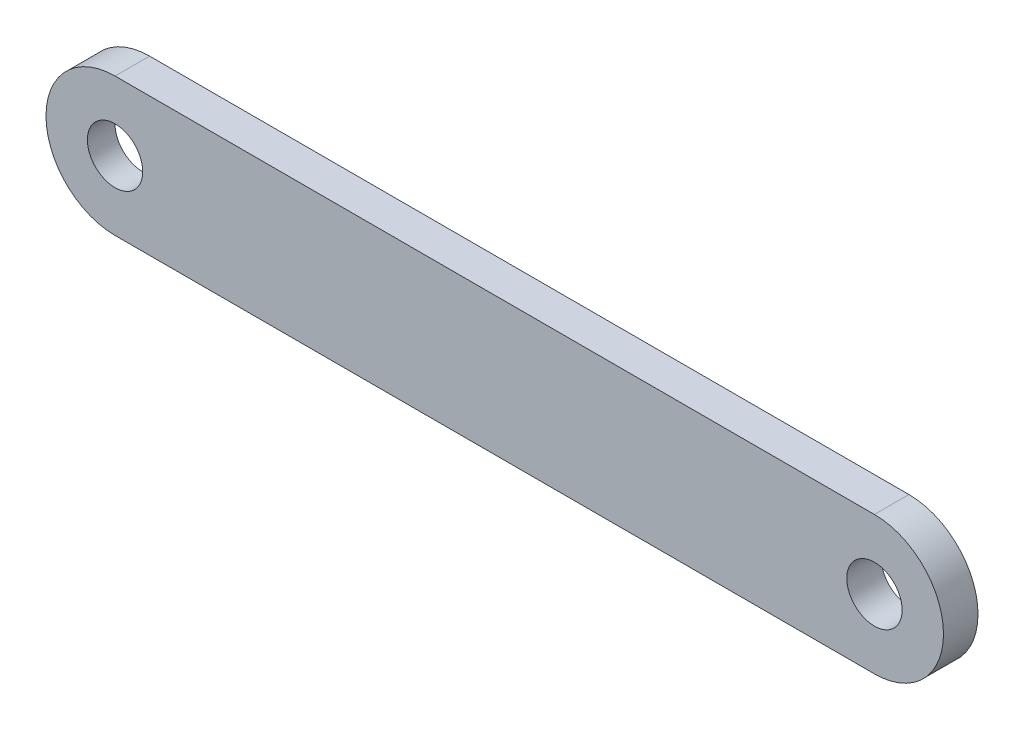
ISO-10303-21;
HEADER;
FILE_DESCRIPTION(('STEP AP214'),'2;1');
FILE_NAME('part.step','',(''),(''),'','','');
FILE_SCHEMA(('AUTOMOTIVE_DESIGN { 1 0 10303 214 1 1 1 1 }'));
ENDSEC;
DATA;
#1=APPLICATION_CONTEXT('core data for automotive mechanical design processes');
#2=APPLICATION_PROTOCOL_DEFINITION('international standard','automotive_design',2000,#1);
#3=PRODUCT_CONTEXT('',#1,'mechanical');
#4=PRODUCT('Part','Part','',(#3));
#5=PRODUCT_RELATED_PRODUCT_CATEGORY('part','',(#4));
#6=PRODUCT_DEFINITION_FORMATION('','',#4);
#7=PRODUCT_DEFINITION_CONTEXT('part definition',#1,'design');
#8=PRODUCT_DEFINITION('design','',#6,#7);
#9=PRODUCT_DEFINITION_SHAPE('','',#8);
#10=(LENGTH_UNIT() NAMED_UNIT(*) SI_UNIT(.MILLI.,.METRE.));
#11=(NAMED_UNIT(*) PLANE_ANGLE_UNIT() SI_UNIT($,.RADIAN.));
#12=(NAMED_UNIT(*) SI_UNIT($,.STERADIAN.) SOLID_ANGLE_UNIT());
#13=UNCERTAINTY_MEASURE_WITH_UNIT(LENGTH_MEASURE(1.E-05),#10,'distance_accuracy_value','');
#14=(GEOMETRIC_REPRESENTATION_CONTEXT(3) GLOBAL_UNCERTAINTY_ASSIGNED_CONTEXT((#13)) GLOBAL_UNIT_ASSIGNED_CONTEXT((#10,
#11,#12)) REPRESENTATION_CONTEXT('',''));
#15=CARTESIAN_POINT('',(0.,0.,0.));
#16=DIRECTION('',(0.,0.,1.));
#17=DIRECTION('',(1.,0.,0.));
#18=AXIS2_PLACEMENT_3D('',#15,#16,#17);
#19=CARTESIAN_POINT('',(0.,0.,5.));
#20=DIRECTION('',(0.,0.,-1.));
#21=DIRECTION('',(-1.,0.,0.));
#22=AXIS2_PLACEMENT_3D('',#19,#20,#21);
#23=CYLINDRICAL_SURFACE('',#22,10.);
#24=CARTESIAN_POINT('',(0.,0.,0.));
#25=DIRECTION('',(0.,0.,1.));
#26=DIRECTION('',(1.,0.,0.));
#27=AXIS2_PLACEMENT_3D('',#24,#25,#26);
#28=CIRCLE('',#27,10.);
#29=CARTESIAN_POINT('',(0.,10.,0.));
#30=VERTEX_POINT('',#29);
#31=CARTESIAN_POINT('',(0.,-10.,0.));
#32=VERTEX_POINT('',#31);
#33=EDGE_CURVE('E151',#30,#32,#28,.T.);
#34=ORIENTED_EDGE('',*,*,#33,.T.);
#35=DIRECTION('',(0.,0.,-1.));
#36=VECTOR('',#35,1.);
#37=CARTESIAN_POINT('',(0.,-10.,5.));
#38=LINE('',#37,#36);
#39=CARTESIAN_POINT('',(0.,-10.,5.));
#40=VERTEX_POINT('',#39);
#41=EDGE_CURVE('E44',#40,#32,#38,.T.);
#42=ORIENTED_EDGE('',*,*,#41,.F.);
#43=CARTESIAN_POINT('',(0.,0.,5.));
#44=DIRECTION('',(0.,0.,1.));
#45=DIRECTION('',(1.,0.,0.));
#46=AXIS2_PLACEMENT_3D('',#43,#44,#45);
#47=CIRCLE('',#46,10.);
#48=CARTESIAN_POINT('',(0.,10.,5.));
#49=VERTEX_POINT('',#48);
#50=EDGE_CURVE('E155',#49,#40,#47,.T.);
#51=ORIENTED_EDGE('',*,*,#50,.F.);
#52=DIRECTION('',(0.,0.,-1.));
#53=VECTOR('',#52,1.);
#54=CARTESIAN_POINT('',(0.,10.,5.));
#55=LINE('',#54,#53);
#56=EDGE_CURVE('E60',#49,#30,#55,.T.);
#57=ORIENTED_EDGE('',*,*,#56,.T.);
#58=EDGE_LOOP('',(#34,#42,#51,#57));
#59=FACE_BOUND('',#58,.T.);
#60=ADVANCED_FACE('F35',(#59),#23,.T.);
#61=CARTESIAN_POINT('',(0.,-10.,5.));
#62=DIRECTION('',(0.,1.,0.));
#63=DIRECTION('',(0.,0.,1.));
#64=AXIS2_PLACEMENT_3D('',#61,#62,#63);
#65=PLANE('',#64);
#66=DIRECTION('',(1.,0.,0.));
#67=VECTOR('',#66,1.);
#68=CARTESIAN_POINT('',(0.,-10.,0.));
#69=LINE('',#68,#67);
#70=CARTESIAN_POINT('',(110.,-10.0000000000639,0.));
#71=VERTEX_POINT('',#70);
#72=EDGE_CURVE('E167',#32,#71,#69,.T.);
#73=ORIENTED_EDGE('',*,*,#72,.T.);
#74=DIRECTION('',(0.,0.,-1.));
#75=VECTOR('',#74,1.);
#76=CARTESIAN_POINT('',(110.,-10.0000000000639,5.));
#77=LINE('',#76,#75);
#78=CARTESIAN_POINT('',(110.,-10.0000000000639,5.));
#79=VERTEX_POINT('',#78);
#80=EDGE_CURVE('E180',#79,#71,#77,.T.);
#81=ORIENTED_EDGE('',*,*,#80,.F.);
#82=DIRECTION('',(1.,0.,0.));
#83=VECTOR('',#82,1.);
#84=CARTESIAN_POINT('',(0.,-10.,5.));
#85=LINE('',#84,#83);
#86=EDGE_CURVE('E87',#40,#79,#85,.T.);
#87=ORIENTED_EDGE('',*,*,#86,.F.);
#88=ORIENTED_EDGE('',*,*,#41,.T.);
#89=EDGE_LOOP('',(#73,#81,#87,#88));
#90=FACE_BOUND('',#89,.T.);
#91=ADVANCED_FACE('F184',(#90),#65,.F.);
#92=CARTESIAN_POINT('',(110.,-6.38881308967498E-11,5.));
#93=DIRECTION('',(0.,0.,-1.));
#94=DIRECTION('',(-1.,0.,0.));
#95=AXIS2_PLACEMENT_3D('',#92,#93,#94);
#96=CYLINDRICAL_SURFACE('',#95,10.0000000000639);
#97=CARTESIAN_POINT('',(110.,-6.38881308967498E-11,0.));
#98=DIRECTION('',(0.,0.,1.));
#99=DIRECTION('',(1.,0.,0.));
#100=AXIS2_PLACEMENT_3D('',#97,#98,#99);
#101=CIRCLE('',#100,10.0000000000639);
#102=CARTESIAN_POINT('',(110.,10.,0.));
#103=VERTEX_POINT('',#102);
#104=EDGE_CURVE('E169',#71,#103,#101,.T.);
#105=ORIENTED_EDGE('',*,*,#104,.T.);
#106=DIRECTION('',(0.,0.,-1.));
#107=VECTOR('',#106,1.);
#108=CARTESIAN_POINT('',(110.,10.,5.));
#109=LINE('',#108,#107);
#110=CARTESIAN_POINT('',(110.,10.,5.));
#111=VERTEX_POINT('',#110);
#112=EDGE_CURVE('E178',#111,#103,#109,.T.);
#113=ORIENTED_EDGE('',*,*,#112,.F.);
#114=CARTESIAN_POINT('',(110.,-6.38881308967498E-11,5.));
#115=DIRECTION('',(0.,0.,1.));
#116=DIRECTION('',(1.,0.,0.));
#117=AXIS2_PLACEMENT_3D('',#114,#115,#116);
#118=CIRCLE('',#117,10.0000000000639);
#119=EDGE_CURVE('E159',#79,#111,#118,.T.);
#120=ORIENTED_EDGE('',*,*,#119,.F.);
#121=ORIENTED_EDGE('',*,*,#80,.T.);
#122=EDGE_LOOP('',(#105,#113,#120,#121));
#123=FACE_BOUND('',#122,.T.);
#124=ADVANCED_FACE('F194',(#123),#96,.T.);
#125=CARTESIAN_POINT('',(0.,10.,5.));
#126=DIRECTION('',(0.,1.,0.));
#127=DIRECTION('',(-1.,0.,0.));
#128=AXIS2_PLACEMENT_3D('',#125,#126,#127);
#129=PLANE('',#128);
#130=DIRECTION('',(1.,0.,0.));
#131=VECTOR('',#130,1.);
#132=CARTESIAN_POINT('',(0.,10.,0.));
#133=LINE('',#132,#131);
#134=EDGE_CURVE('E172',#30,#103,#133,.T.);
#135=ORIENTED_EDGE('',*,*,#134,.F.);
#136=ORIENTED_EDGE('',*,*,#56,.F.);
#137=DIRECTION('',(1.,0.,0.));
#138=VECTOR('',#137,1.);
#139=CARTESIAN_POINT('',(0.,10.,5.));
#140=LINE('',#139,#138);
#141=EDGE_CURVE('E161',#49,#111,#140,.T.);
#142=ORIENTED_EDGE('',*,*,#141,.T.);
#143=ORIENTED_EDGE('',*,*,#112,.T.);
#144=EDGE_LOOP('',(#135,#136,#142,#143));
#145=FACE_BOUND('',#144,.T.);
#146=ADVANCED_FACE('F189',(#145),#129,.T.);
#147=CARTESIAN_POINT('',(0.,0.,5.));
#148=DIRECTION('',(0.,0.,-1.));
#149=DIRECTION('',(-1.,0.,0.));
#150=AXIS2_PLACEMENT_3D('',#147,#148,#149);
#151=CYLINDRICAL_SURFACE('',#150,4.01);
#152=CARTESIAN_POINT('',(0.,0.,1.));
#153=DIRECTION('',(0.,0.,1.));
#154=DIRECTION('',(1.,0.,0.));
#155=AXIS2_PLACEMENT_3D('',#152,#153,#154);
#156=CIRCLE('',#155,4.01);
#157=CARTESIAN_POINT('',(4.01,0.,1.));
#158=VERTEX_POINT('',#157);
#159=EDGE_CURVE('E39',#158,#158,#156,.T.);
#160=ORIENTED_EDGE('',*,*,#159,.F.);
#161=EDGE_LOOP('',(#160));
#162=FACE_BOUND('',#161,.T.);
#163=CARTESIAN_POINT('',(0.,0.,5.));
#164=DIRECTION('',(0.,0.,1.));
#165=DIRECTION('',(1.,0.,0.));
#166=AXIS2_PLACEMENT_3D('',#163,#164,#165);
#167=CIRCLE('',#166,4.01);
#168=CARTESIAN_POINT('',(4.01,0.,5.));
#169=VERTEX_POINT('',#168);
#170=EDGE_CURVE('E152',#169,#169,#167,.T.);
#171=ORIENTED_EDGE('',*,*,#170,.T.);
#172=EDGE_LOOP('',(#171));
#173=FACE_BOUND('',#172,.T.);
#174=ADVANCED_FACE('F37',(#162,#173),#151,.F.);
#175=CARTESIAN_POINT('',(110.,-6.38881308967498E-11,5.));
#176=DIRECTION('',(0.,0.,-1.));
#177=DIRECTION('',(-1.,0.,0.));
#178=AXIS2_PLACEMENT_3D('',#175,#176,#177);
#179=CYLINDRICAL_SURFACE('',#178,4.01);
#180=CARTESIAN_POINT('',(110.,-6.38881308967498E-11,5.));
#181=DIRECTION('',(0.,0.,1.));
#182=DIRECTION('',(1.,0.,0.));
#183=AXIS2_PLACEMENT_3D('',#180,#181,#182);
#184=CIRCLE('',#183,4.01);
#185=CARTESIAN_POINT('',(114.01,-6.38881308967498E-11,5.));
#186=VERTEX_POINT('',#185);
#187=EDGE_CURVE('E163',#186,#186,#184,.T.);
#188=ORIENTED_EDGE('',*,*,#187,.T.);
#189=EDGE_LOOP('',(#188));
#190=FACE_BOUND('',#189,.T.);
#191=CARTESIAN_POINT('',(110.,-6.38881308967498E-11,0.));
#192=DIRECTION('',(0.,0.,1.));
#193=DIRECTION('',(1.,0.,0.));
#194=AXIS2_PLACEMENT_3D('',#191,#192,#193);
#195=CIRCLE('',#194,4.01);
#196=CARTESIAN_POINT('',(114.01,-6.38881308967498E-11,0.));
#197=VERTEX_POINT('',#196);
#198=EDGE_CURVE('E156',#197,#197,#195,.T.);
#199=ORIENTED_EDGE('',*,*,#198,.F.);
#200=EDGE_LOOP('',(#199));
#201=FACE_BOUND('',#200,.T.);
#202=ADVANCED_FACE('F199',(#190,#201),#179,.F.);
#203=CARTESIAN_POINT('',(0.,0.,5.));
#204=DIRECTION('',(0.,0.,1.));
#205=DIRECTION('',(1.,0.,0.));
#206=AXIS2_PLACEMENT_3D('',#203,#204,#205);
#207=PLANE('',#206);
#208=ORIENTED_EDGE('',*,*,#170,.F.);
#209=EDGE_LOOP('',(#208));
#210=FACE_BOUND('',#209,.T.);
#211=ORIENTED_EDGE('',*,*,#50,.T.);
#212=ORIENTED_EDGE('',*,*,#86,.T.);
#213=ORIENTED_EDGE('',*,*,#119,.T.);
#214=ORIENTED_EDGE('',*,*,#141,.F.);
#215=EDGE_LOOP('',(#211,#212,#213,#214));
#216=FACE_BOUND('',#215,.T.);
#217=ORIENTED_EDGE('',*,*,#187,.F.);
#218=EDGE_LOOP('',(#217));
#219=FACE_BOUND('',#218,.T.);
#220=ADVANCED_FACE('F196',(#210,#216,#219),#207,.T.);
#221=CARTESIAN_POINT('',(0.,0.,0.));
#222=DIRECTION('',(0.,0.,1.));
#223=DIRECTION('',(1.,0.,0.));
#224=AXIS2_PLACEMENT_3D('',#221,#222,#223);
#225=PLANE('',#224);
#226=DIRECTION('',(1.,0.,0.));
#227=VECTOR('',#226,1.);
#228=CARTESIAN_POINT('',(6.05,5.05,0.));
#229=LINE('',#228,#227);
#230=CARTESIAN_POINT('',(-6.05,5.05,0.));
#231=VERTEX_POINT('',#230);
#232=CARTESIAN_POINT('',(6.05,5.05,0.));
#233=VERTEX_POINT('',#232);
#234=EDGE_CURVE('E139',#231,#233,#229,.T.);
#235=ORIENTED_EDGE('',*,*,#234,.F.);
#236=DIRECTION('',(0.,1.,0.));
#237=VECTOR('',#236,1.);
#238=CARTESIAN_POINT('',(-6.05,-5.05,0.));
#239=LINE('',#238,#237);
#240=CARTESIAN_POINT('',(-6.05,-5.05,0.));
#241=VERTEX_POINT('',#240);
#242=EDGE_CURVE('E51',#241,#231,#239,.T.);
#243=ORIENTED_EDGE('',*,*,#242,.F.);
#244=DIRECTION('',(-1.,0.,0.));
#245=VECTOR('',#244,1.);
#246=CARTESIAN_POINT('',(6.05,-5.05,0.));
#247=LINE('',#246,#245);
#248=CARTESIAN_POINT('',(6.05,-5.05,0.));
#249=VERTEX_POINT('',#248);
#250=EDGE_CURVE('E130',#249,#241,#247,.T.);
#251=ORIENTED_EDGE('',*,*,#250,.F.);
#252=DIRECTION('',(0.,-1.,0.));
#253=VECTOR('',#252,1.);
#254=CARTESIAN_POINT('',(6.05,-5.05,0.));
#255=LINE('',#254,#253);
#256=EDGE_CURVE('E133',#233,#249,#255,.T.);
#257=ORIENTED_EDGE('',*,*,#256,.F.);
#258=EDGE_LOOP('',(#235,#243,#251,#257));
#259=FACE_BOUND('',#258,.T.);
#260=CARTESIAN_POINT('',(20.,0.,0.));
#261=DIRECTION('',(0.,0.,1.));
#262=DIRECTION('',(1.,0.,0.));
#263=AXIS2_PLACEMENT_3D('',#260,#261,#262);
#264=CIRCLE('',#263,1.49);
#265=CARTESIAN_POINT('',(21.49,0.,0.));
#266=VERTEX_POINT('',#265);
#267=EDGE_CURVE('E11',#266,#266,#264,.F.);
#268=ORIENTED_EDGE('',*,*,#267,.F.);
#269=EDGE_LOOP('',(#268));
#270=FACE_BOUND('',#269,.T.);
#271=ORIENTED_EDGE('',*,*,#33,.F.);
#272=ORIENTED_EDGE('',*,*,#134,.T.);
#273=ORIENTED_EDGE('',*,*,#104,.F.);
#274=ORIENTED_EDGE('',*,*,#72,.F.);
#275=EDGE_LOOP('',(#271,#272,#273,#274));
#276=FACE_BOUND('',#275,.T.);
#277=ORIENTED_EDGE('',*,*,#198,.T.);
#278=EDGE_LOOP('',(#277));
#279=FACE_BOUND('',#278,.T.);
#280=ADVANCED_FACE('F186',(#259,#270,#276,#279),#225,.F.);
#281=CARTESIAN_POINT('',(20.,0.,-4.));
#282=DIRECTION('',(0.,0.,1.));
#283=DIRECTION('',(1.,0.,0.));
#284=AXIS2_PLACEMENT_3D('',#281,#282,#283);
#285=CYLINDRICAL_SURFACE('',#284,1.49);
#286=CARTESIAN_POINT('',(20.,0.,-4.));
#287=DIRECTION('',(0.,0.,-1.));
#288=DIRECTION('',(-1.,0.,0.));
#289=AXIS2_PLACEMENT_3D('',#286,#287,#288);
#290=CIRCLE('',#289,1.49);
#291=CARTESIAN_POINT('',(18.51,0.,-4.));
#292=VERTEX_POINT('',#291);
#293=EDGE_CURVE('E148',#292,#292,#290,.T.);
#294=ORIENTED_EDGE('',*,*,#293,.F.);
#295=EDGE_LOOP('',(#294));
#296=FACE_BOUND('',#295,.T.);
#297=ORIENTED_EDGE('',*,*,#267,.T.);
#298=EDGE_LOOP('',(#297));
#299=FACE_BOUND('',#298,.T.);
#300=ADVANCED_FACE('F209',(#296,#299),#285,.T.);
#301=CARTESIAN_POINT('',(20.,0.,-4.));
#302=DIRECTION('',(0.,0.,-1.));
#303=DIRECTION('',(-1.,0.,0.));
#304=AXIS2_PLACEMENT_3D('',#301,#302,#303);
#305=PLANE('',#304);
#306=ORIENTED_EDGE('',*,*,#293,.T.);
#307=EDGE_LOOP('',(#306));
#308=FACE_BOUND('',#307,.T.);
#309=ADVANCED_FACE('F215',(#308),#305,.T.);
#310=CARTESIAN_POINT('',(-6.05,-5.05,1.));
#311=DIRECTION('',(-1.,0.,0.));
#312=DIRECTION('',(0.,0.,1.));
#313=AXIS2_PLACEMENT_3D('',#310,#311,#312);
#314=PLANE('',#313);
#315=ORIENTED_EDGE('',*,*,#242,.T.);
#316=DIRECTION('',(0.,0.,-1.));
#317=VECTOR('',#316,1.);
#318=CARTESIAN_POINT('',(-6.05,5.05,1.));
#319=LINE('',#318,#317);
#320=CARTESIAN_POINT('',(-6.05,5.05,1.));
#321=VERTEX_POINT('',#320);
#322=EDGE_CURVE('E108',#321,#231,#319,.T.);
#323=ORIENTED_EDGE('',*,*,#322,.F.);
#324=DIRECTION('',(0.,1.,0.));
#325=VECTOR('',#324,1.);
#326=CARTESIAN_POINT('',(-6.05,-5.05,1.));
#327=LINE('',#326,#325);
#328=CARTESIAN_POINT('',(-6.05,-5.05,1.));
#329=VERTEX_POINT('',#328);
#330=EDGE_CURVE('E112',#329,#321,#327,.T.);
#331=ORIENTED_EDGE('',*,*,#330,.F.);
#332=DIRECTION('',(0.,0.,-1.));
#333=VECTOR('',#332,1.);
#334=CARTESIAN_POINT('',(-6.05,-5.05,1.));
#335=LINE('',#334,#333);
#336=EDGE_CURVE('E143',#329,#241,#335,.T.);
#337=ORIENTED_EDGE('',*,*,#336,.T.);
#338=EDGE_LOOP('',(#315,#323,#331,#337));
#339=FACE_BOUND('',#338,.T.);
#340=ADVANCED_FACE('F110',(#339),#314,.F.);
#341=CARTESIAN_POINT('',(6.05,-5.05,1.));
#342=DIRECTION('',(0.,-1.,0.));
#343=DIRECTION('',(0.,0.,-1.));
#344=AXIS2_PLACEMENT_3D('',#341,#342,#343);
#345=PLANE('',#344);
#346=ORIENTED_EDGE('',*,*,#250,.T.);
#347=ORIENTED_EDGE('',*,*,#336,.F.);
#348=DIRECTION('',(-1.,0.,0.));
#349=VECTOR('',#348,1.);
#350=CARTESIAN_POINT('',(6.05,-5.05,1.));
#351=LINE('',#350,#349);
#352=CARTESIAN_POINT('',(6.05,-5.05,1.));
#353=VERTEX_POINT('',#352);
#354=EDGE_CURVE('E118',#353,#329,#351,.T.);
#355=ORIENTED_EDGE('',*,*,#354,.F.);
#356=DIRECTION('',(0.,0.,-1.));
#357=VECTOR('',#356,1.);
#358=CARTESIAN_POINT('',(6.05,-5.05,1.));
#359=LINE('',#358,#357);
#360=EDGE_CURVE('E145',#353,#249,#359,.T.);
#361=ORIENTED_EDGE('',*,*,#360,.T.);
#362=EDGE_LOOP('',(#346,#347,#355,#361));
#363=FACE_BOUND('',#362,.T.);
#364=ADVANCED_FACE('F247',(#363),#345,.F.);
#365=CARTESIAN_POINT('',(6.05,-5.05,1.));
#366=DIRECTION('',(1.,0.,0.));
#367=DIRECTION('',(0.,0.,-1.));
#368=AXIS2_PLACEMENT_3D('',#365,#366,#367);
#369=PLANE('',#368);
#370=ORIENTED_EDGE('',*,*,#256,.T.);
#371=ORIENTED_EDGE('',*,*,#360,.F.);
#372=DIRECTION('',(0.,-1.,0.));
#373=VECTOR('',#372,1.);
#374=CARTESIAN_POINT('',(6.05,-5.05,1.));
#375=LINE('',#374,#373);
#376=CARTESIAN_POINT('',(6.05,5.05,1.));
#377=VERTEX_POINT('',#376);
#378=EDGE_CURVE('E126',#377,#353,#375,.T.);
#379=ORIENTED_EDGE('',*,*,#378,.F.);
#380=DIRECTION('',(0.,0.,-1.));
#381=VECTOR('',#380,1.);
#382=CARTESIAN_POINT('',(6.05,5.05,1.));
#383=LINE('',#382,#381);
#384=EDGE_CURVE('E117',#377,#233,#383,.T.);
#385=ORIENTED_EDGE('',*,*,#384,.T.);
#386=EDGE_LOOP('',(#370,#371,#379,#385));
#387=FACE_BOUND('',#386,.T.);
#388=ADVANCED_FACE('F244',(#387),#369,.F.);
#389=CARTESIAN_POINT('',(6.05,5.05,1.));
#390=DIRECTION('',(0.,1.,0.));
#391=DIRECTION('',(0.,0.,1.));
#392=AXIS2_PLACEMENT_3D('',#389,#390,#391);
#393=PLANE('',#392);
#394=ORIENTED_EDGE('',*,*,#234,.T.);
#395=ORIENTED_EDGE('',*,*,#384,.F.);
#396=DIRECTION('',(1.,0.,0.));
#397=VECTOR('',#396,1.);
#398=CARTESIAN_POINT('',(6.05,5.05,1.));
#399=LINE('',#398,#397);
#400=EDGE_CURVE('E121',#321,#377,#399,.T.);
#401=ORIENTED_EDGE('',*,*,#400,.F.);
#402=ORIENTED_EDGE('',*,*,#322,.T.);
#403=EDGE_LOOP('',(#394,#395,#401,#402));
#404=FACE_BOUND('',#403,.T.);
#405=ADVANCED_FACE('F122',(#404),#393,.F.);
#406=CARTESIAN_POINT('',(0.,0.,1.));
#407=DIRECTION('',(0.,0.,1.));
#408=DIRECTION('',(1.,0.,0.));
#409=AXIS2_PLACEMENT_3D('',#406,#407,#408);
#410=PLANE('',#409);
#411=ORIENTED_EDGE('',*,*,#159,.T.);
#412=EDGE_LOOP('',(#411));
#413=FACE_BOUND('',#412,.T.);
#414=ORIENTED_EDGE('',*,*,#330,.T.);
#415=ORIENTED_EDGE('',*,*,#400,.T.);
#416=ORIENTED_EDGE('',*,*,#378,.T.);
#417=ORIENTED_EDGE('',*,*,#354,.T.);
#418=EDGE_LOOP('',(#414,#415,#416,#417));
#419=FACE_BOUND('',#418,.T.);
#420=ADVANCED_FACE('F128',(#413,#419),#410,.F.);
#421=CLOSED_SHELL('',(#60,#91,#124,#146,#174,#202,#220,#280,#300,#309,#340,#364,#388,#405,#420));
#422=MANIFOLD_SOLID_BREP('B2',#421);
#423=ADVANCED_BREP_SHAPE_REPRESENTATION('',(#18,#422),#14);
#424=SHAPE_DEFINITION_REPRESENTATION(#9,#423);
ENDSEC;
END-ISO-10303-21;
